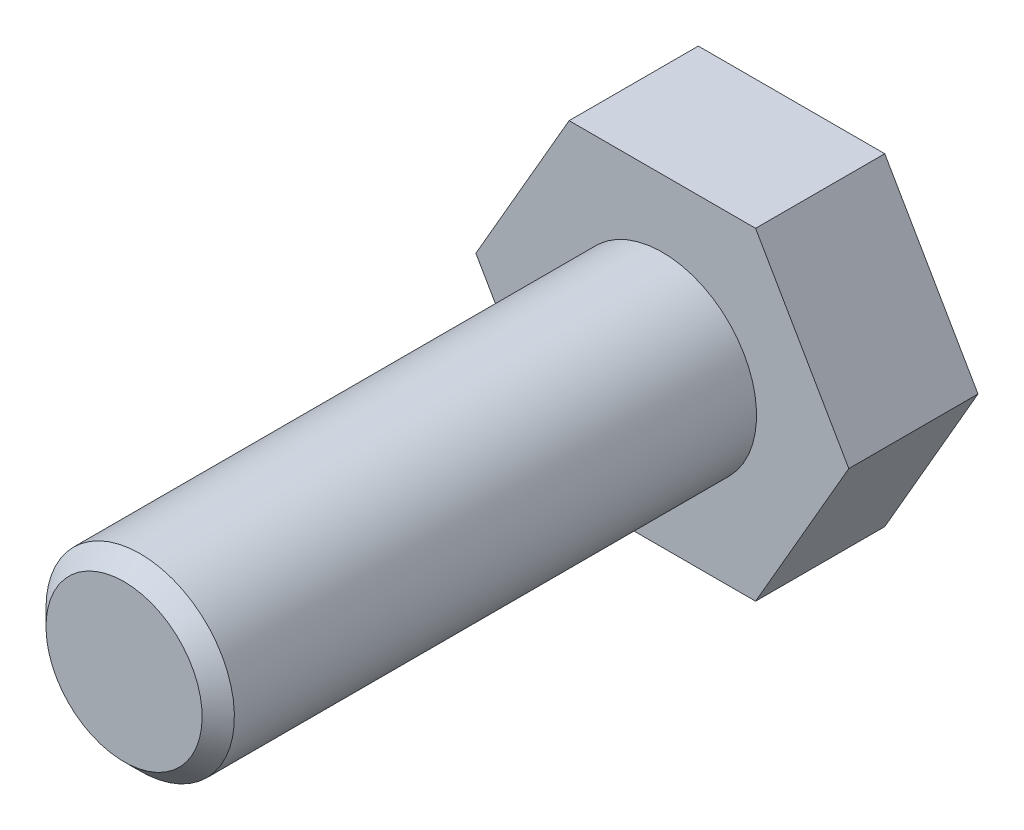
ISO-10303-21;
HEADER;
FILE_DESCRIPTION(('STEP AP214'),'2;1');
FILE_NAME('part.step','',(''),(''),'','','');
FILE_SCHEMA(('AUTOMOTIVE_DESIGN { 1 0 10303 214 1 1 1 1 }'));
ENDSEC;
DATA;
#1=APPLICATION_CONTEXT('core data for automotive mechanical design processes');
#2=APPLICATION_PROTOCOL_DEFINITION('international standard','automotive_design',2000,#1);
#3=PRODUCT_CONTEXT('',#1,'mechanical');
#4=PRODUCT('Part','Part','',(#3));
#5=PRODUCT_RELATED_PRODUCT_CATEGORY('part','',(#4));
#6=PRODUCT_DEFINITION_FORMATION('','',#4);
#7=PRODUCT_DEFINITION_CONTEXT('part definition',#1,'design');
#8=PRODUCT_DEFINITION('design','',#6,#7);
#9=PRODUCT_DEFINITION_SHAPE('','',#8);
#10=(LENGTH_UNIT() NAMED_UNIT(*) SI_UNIT(.MILLI.,.METRE.));
#11=(NAMED_UNIT(*) PLANE_ANGLE_UNIT() SI_UNIT($,.RADIAN.));
#12=(NAMED_UNIT(*) SI_UNIT($,.STERADIAN.) SOLID_ANGLE_UNIT());
#13=UNCERTAINTY_MEASURE_WITH_UNIT(LENGTH_MEASURE(1.E-05),#10,'distance_accuracy_value','');
#14=(GEOMETRIC_REPRESENTATION_CONTEXT(3) GLOBAL_UNCERTAINTY_ASSIGNED_CONTEXT((#13)) GLOBAL_UNIT_ASSIGNED_CONTEXT((#10,
#11,#12)) REPRESENTATION_CONTEXT('',''));
#15=CARTESIAN_POINT('',(0.,0.,0.));
#16=DIRECTION('',(0.,0.,1.));
#17=DIRECTION('',(1.,0.,0.));
#18=AXIS2_PLACEMENT_3D('',#15,#16,#17);
#19=CARTESIAN_POINT('',(0.,0.,0.));
#20=DIRECTION('',(0.,0.,1.));
#21=DIRECTION('',(1.,0.,0.));
#22=AXIS2_PLACEMENT_3D('',#19,#20,#21);
#23=PLANE('',#22);
#24=DIRECTION('',(0.500000000000002,-0.866025403784437,0.));
#25=VECTOR('',#24,1.);
#26=CARTESIAN_POINT('',(3.46410161513775,0.,0.));
#27=LINE('',#26,#25);
#28=CARTESIAN_POINT('',(1.73205080756886,3.00000000000001,0.));
#29=VERTEX_POINT('',#28);
#30=CARTESIAN_POINT('',(3.46410161513775,0.,0.));
#31=VERTEX_POINT('',#30);
#32=EDGE_CURVE('E117',#29,#31,#27,.T.);
#33=ORIENTED_EDGE('',*,*,#32,.T.);
#34=DIRECTION('',(-0.499999999999998,-0.86602540378444,0.));
#35=VECTOR('',#34,1.);
#36=CARTESIAN_POINT('',(1.73205080756888,-2.99999999999999,0.));
#37=LINE('',#36,#35);
#38=CARTESIAN_POINT('',(1.73205080756888,-2.99999999999999,0.));
#39=VERTEX_POINT('',#38);
#40=EDGE_CURVE('E121',#31,#39,#37,.T.);
#41=ORIENTED_EDGE('',*,*,#40,.T.);
#42=DIRECTION('',(-1.,0.,0.));
#43=VECTOR('',#42,1.);
#44=CARTESIAN_POINT('',(-1.73205080756888,-3.,0.));
#45=LINE('',#44,#43);
#46=CARTESIAN_POINT('',(-1.73205080756887,-3.,0.));
#47=VERTEX_POINT('',#46);
#48=EDGE_CURVE('E126',#39,#47,#45,.T.);
#49=ORIENTED_EDGE('',*,*,#48,.T.);
#50=DIRECTION('',(-0.5,0.866025403784438,0.));
#51=VECTOR('',#50,1.);
#52=CARTESIAN_POINT('',(-3.46410161513775,0.,0.));
#53=LINE('',#52,#51);
#54=CARTESIAN_POINT('',(-3.46410161513775,0.,0.));
#55=VERTEX_POINT('',#54);
#56=EDGE_CURVE('E82',#47,#55,#53,.T.);
#57=ORIENTED_EDGE('',*,*,#56,.T.);
#58=DIRECTION('',(0.5,0.866025403784439,0.));
#59=VECTOR('',#58,1.);
#60=CARTESIAN_POINT('',(-1.73205080756888,3.,0.));
#61=LINE('',#60,#59);
#62=CARTESIAN_POINT('',(-1.73205080756888,3.,0.));
#63=VERTEX_POINT('',#62);
#64=EDGE_CURVE('E66',#55,#63,#61,.T.);
#65=ORIENTED_EDGE('',*,*,#64,.T.);
#66=DIRECTION('',(1.,0.,0.));
#67=VECTOR('',#66,1.);
#68=CARTESIAN_POINT('',(1.73205080756887,3.,0.));
#69=LINE('',#68,#67);
#70=EDGE_CURVE('E71',#63,#29,#69,.T.);
#71=ORIENTED_EDGE('',*,*,#70,.T.);
#72=EDGE_LOOP('',(#33,#41,#49,#57,#65,#71));
#73=FACE_BOUND('',#72,.T.);
#74=ADVANCED_FACE('F16',(#73),#23,.F.);
#75=CARTESIAN_POINT('',(1.73205080756887,3.,2.4));
#76=DIRECTION('',(0.,-1.,0.));
#77=DIRECTION('',(1.,0.,0.));
#78=AXIS2_PLACEMENT_3D('',#75,#76,#77);
#79=PLANE('',#78);
#80=DIRECTION('',(0.,0.,1.));
#81=VECTOR('',#80,1.);
#82=CARTESIAN_POINT('',(-1.73205080756888,3.,2.4));
#83=LINE('',#82,#81);
#84=CARTESIAN_POINT('',(-1.73205080756888,3.,2.4));
#85=VERTEX_POINT('',#84);
#86=EDGE_CURVE('E73',#63,#85,#83,.T.);
#87=ORIENTED_EDGE('',*,*,#86,.T.);
#88=DIRECTION('',(1.,0.,0.));
#89=VECTOR('',#88,1.);
#90=CARTESIAN_POINT('',(0.,3.00000000000001,2.4));
#91=LINE('',#90,#89);
#92=CARTESIAN_POINT('',(1.73205080756886,3.00000000000001,2.4));
#93=VERTEX_POINT('',#92);
#94=EDGE_CURVE('E115',#93,#85,#91,.F.);
#95=ORIENTED_EDGE('',*,*,#94,.F.);
#96=DIRECTION('',(0.,0.,1.));
#97=VECTOR('',#96,1.);
#98=CARTESIAN_POINT('',(1.73205080756886,3.00000000000001,2.4));
#99=LINE('',#98,#97);
#100=EDGE_CURVE('E76',#93,#29,#99,.F.);
#101=ORIENTED_EDGE('',*,*,#100,.T.);
#102=ORIENTED_EDGE('',*,*,#70,.F.);
#103=EDGE_LOOP('',(#87,#95,#101,#102));
#104=FACE_BOUND('',#103,.T.);
#105=ADVANCED_FACE('F72',(#104),#79,.F.);
#106=CARTESIAN_POINT('',(-1.73205080756888,3.,2.4));
#107=DIRECTION('',(0.866025403784439,-0.5,0.));
#108=DIRECTION('',(0.5,0.866025403784439,0.));
#109=AXIS2_PLACEMENT_3D('',#106,#107,#108);
#110=PLANE('',#109);
#111=DIRECTION('',(0.,0.,1.));
#112=VECTOR('',#111,1.);
#113=CARTESIAN_POINT('',(-3.46410161513775,0.,2.4));
#114=LINE('',#113,#112);
#115=CARTESIAN_POINT('',(-3.46410161513775,0.,2.4));
#116=VERTEX_POINT('',#115);
#117=EDGE_CURVE('E84',#55,#116,#114,.T.);
#118=ORIENTED_EDGE('',*,*,#117,.T.);
#119=DIRECTION('',(-0.499999999999998,-0.866025403784439,0.));
#120=VECTOR('',#119,1.);
#121=CARTESIAN_POINT('',(-1.73205080756888,3.,2.4));
#122=LINE('',#121,#120);
#123=EDGE_CURVE('E88',#85,#116,#122,.T.);
#124=ORIENTED_EDGE('',*,*,#123,.F.);
#125=ORIENTED_EDGE('',*,*,#86,.F.);
#126=ORIENTED_EDGE('',*,*,#64,.F.);
#127=EDGE_LOOP('',(#118,#124,#125,#126));
#128=FACE_BOUND('',#127,.T.);
#129=ADVANCED_FACE('F86',(#128),#110,.F.);
#130=CARTESIAN_POINT('',(-3.46410161513775,0.,2.4));
#131=DIRECTION('',(0.866025403784438,0.5,0.));
#132=DIRECTION('',(-0.5,0.866025403784438,0.));
#133=AXIS2_PLACEMENT_3D('',#130,#131,#132);
#134=PLANE('',#133);
#135=DIRECTION('',(0.,0.,1.));
#136=VECTOR('',#135,1.);
#137=CARTESIAN_POINT('',(-1.73205080756887,-3.,2.4));
#138=LINE('',#137,#136);
#139=CARTESIAN_POINT('',(-1.73205080756887,-3.,2.4));
#140=VERTEX_POINT('',#139);
#141=EDGE_CURVE('E128',#47,#140,#138,.T.);
#142=ORIENTED_EDGE('',*,*,#141,.T.);
#143=DIRECTION('',(0.500000000000001,-0.866025403784438,0.));
#144=VECTOR('',#143,1.);
#145=CARTESIAN_POINT('',(-3.46410161513775,0.,2.4));
#146=LINE('',#145,#144);
#147=EDGE_CURVE('E111',#116,#140,#146,.T.);
#148=ORIENTED_EDGE('',*,*,#147,.F.);
#149=ORIENTED_EDGE('',*,*,#117,.F.);
#150=ORIENTED_EDGE('',*,*,#56,.F.);
#151=EDGE_LOOP('',(#142,#148,#149,#150));
#152=FACE_BOUND('',#151,.T.);
#153=ADVANCED_FACE('F132',(#152),#134,.F.);
#154=CARTESIAN_POINT('',(-1.73205080756888,-3.,2.4));
#155=DIRECTION('',(0.,1.,0.));
#156=DIRECTION('',(-1.,0.,0.));
#157=AXIS2_PLACEMENT_3D('',#154,#155,#156);
#158=PLANE('',#157);
#159=DIRECTION('',(0.,0.,1.));
#160=VECTOR('',#159,1.);
#161=CARTESIAN_POINT('',(1.73205080756888,-2.99999999999999,2.4));
#162=LINE('',#161,#160);
#163=CARTESIAN_POINT('',(1.73205080756888,-2.99999999999999,2.4));
#164=VERTEX_POINT('',#163);
#165=EDGE_CURVE('E124',#39,#164,#162,.T.);
#166=ORIENTED_EDGE('',*,*,#165,.T.);
#167=DIRECTION('',(1.,0.,0.));
#168=VECTOR('',#167,1.);
#169=CARTESIAN_POINT('',(0.,-3.,2.4));
#170=LINE('',#169,#168);
#171=EDGE_CURVE('E104',#140,#164,#170,.T.);
#172=ORIENTED_EDGE('',*,*,#171,.F.);
#173=ORIENTED_EDGE('',*,*,#141,.F.);
#174=ORIENTED_EDGE('',*,*,#48,.F.);
#175=EDGE_LOOP('',(#166,#172,#173,#174));
#176=FACE_BOUND('',#175,.T.);
#177=ADVANCED_FACE('F142',(#176),#158,.F.);
#178=CARTESIAN_POINT('',(1.73205080756888,-2.99999999999999,2.4));
#179=DIRECTION('',(-0.86602540378444,0.499999999999998,0.));
#180=DIRECTION('',(-0.499999999999998,-0.86602540378444,0.));
#181=AXIS2_PLACEMENT_3D('',#178,#179,#180);
#182=PLANE('',#181);
#183=DIRECTION('',(0.,0.,1.));
#184=VECTOR('',#183,1.);
#185=CARTESIAN_POINT('',(3.46410161513775,0.,2.4));
#186=LINE('',#185,#184);
#187=CARTESIAN_POINT('',(3.46410161513775,0.,2.4));
#188=VERTEX_POINT('',#187);
#189=EDGE_CURVE('E34',#31,#188,#186,.T.);
#190=ORIENTED_EDGE('',*,*,#189,.T.);
#191=DIRECTION('',(0.499999999999998,0.866025403784439,0.));
#192=VECTOR('',#191,1.);
#193=CARTESIAN_POINT('',(1.73205080756888,-2.99999999999999,2.4));
#194=LINE('',#193,#192);
#195=EDGE_CURVE('E100',#164,#188,#194,.T.);
#196=ORIENTED_EDGE('',*,*,#195,.F.);
#197=ORIENTED_EDGE('',*,*,#165,.F.);
#198=ORIENTED_EDGE('',*,*,#40,.F.);
#199=EDGE_LOOP('',(#190,#196,#197,#198));
#200=FACE_BOUND('',#199,.T.);
#201=ADVANCED_FACE('F140',(#200),#182,.F.);
#202=CARTESIAN_POINT('',(3.46410161513775,0.,2.4));
#203=DIRECTION('',(-0.866025403784437,-0.500000000000002,0.));
#204=DIRECTION('',(0.500000000000002,-0.866025403784437,0.));
#205=AXIS2_PLACEMENT_3D('',#202,#203,#204);
#206=PLANE('',#205);
#207=ORIENTED_EDGE('',*,*,#100,.F.);
#208=DIRECTION('',(-0.500000000000003,0.866025403784437,0.));
#209=VECTOR('',#208,1.);
#210=CARTESIAN_POINT('',(3.46410161513775,0.,2.4));
#211=LINE('',#210,#209);
#212=EDGE_CURVE('E96',#188,#93,#211,.T.);
#213=ORIENTED_EDGE('',*,*,#212,.F.);
#214=ORIENTED_EDGE('',*,*,#189,.F.);
#215=ORIENTED_EDGE('',*,*,#32,.F.);
#216=EDGE_LOOP('',(#207,#213,#214,#215));
#217=FACE_BOUND('',#216,.T.);
#218=ADVANCED_FACE('F138',(#217),#206,.F.);
#219=CARTESIAN_POINT('',(0.,0.,12.4));
#220=DIRECTION('',(0.,0.,-1.));
#221=DIRECTION('',(-1.,0.,0.));
#222=AXIS2_PLACEMENT_3D('',#219,#220,#221);
#223=PLANE('',#222);
#224=CARTESIAN_POINT('',(0.,0.,12.4000000000137));
#225=DIRECTION('',(0.,0.,-1.));
#226=DIRECTION('',(0.,1.,0.));
#227=AXIS2_PLACEMENT_3D('',#224,#225,#226);
#228=CIRCLE('',#227,1.44999999992023);
#229=CARTESIAN_POINT('',(0.,1.44999999992024,12.4000000000137));
#230=VERTEX_POINT('',#229);
#231=EDGE_CURVE('E19',#230,#230,#228,.T.);
#232=ORIENTED_EDGE('',*,*,#231,.F.);
#233=EDGE_LOOP('',(#232));
#234=FACE_BOUND('',#233,.T.);
#235=ADVANCED_FACE('F165',(#234),#223,.F.);
#236=CARTESIAN_POINT('',(0.,0.,2.4));
#237=DIRECTION('',(0.,0.,1.));
#238=DIRECTION('',(1.,0.,0.));
#239=AXIS2_PLACEMENT_3D('',#236,#237,#238);
#240=PLANE('',#239);
#241=ORIENTED_EDGE('',*,*,#195,.T.);
#242=ORIENTED_EDGE('',*,*,#212,.T.);
#243=ORIENTED_EDGE('',*,*,#94,.T.);
#244=ORIENTED_EDGE('',*,*,#123,.T.);
#245=ORIENTED_EDGE('',*,*,#147,.T.);
#246=ORIENTED_EDGE('',*,*,#171,.T.);
#247=EDGE_LOOP('',(#241,#242,#243,#244,#245,#246));
#248=FACE_BOUND('',#247,.T.);
#249=CARTESIAN_POINT('',(0.,0.,2.4));
#250=DIRECTION('',(0.,0.,-1.));
#251=DIRECTION('',(-1.,0.,0.));
#252=AXIS2_PLACEMENT_3D('',#249,#250,#251);
#253=CIRCLE('',#252,1.75);
#254=CARTESIAN_POINT('',(-1.75,0.,2.4));
#255=VERTEX_POINT('',#254);
#256=EDGE_CURVE('E25',#255,#255,#253,.F.);
#257=ORIENTED_EDGE('',*,*,#256,.F.);
#258=EDGE_LOOP('',(#257));
#259=FACE_BOUND('',#258,.T.);
#260=ADVANCED_FACE('F135',(#248,#259),#240,.T.);
#261=CARTESIAN_POINT('',(0.,0.,12.0999999999185));
#262=DIRECTION('',(0.,0.,-1.));
#263=DIRECTION('',(0.,1.,0.));
#264=AXIS2_PLACEMENT_3D('',#261,#262,#263);
#265=CONICAL_SURFACE('',#264,1.74999999995861,0.785398163302709);
#266=CARTESIAN_POINT('',(0.,0.,12.1));
#267=DIRECTION('',(0.,0.,-1.));
#268=DIRECTION('',(-1.,0.,0.));
#269=AXIS2_PLACEMENT_3D('',#266,#267,#268);
#270=CIRCLE('',#269,1.75);
#271=CARTESIAN_POINT('',(-1.75,0.,12.1));
#272=VERTEX_POINT('',#271);
#273=EDGE_CURVE('E11',#272,#272,#270,.T.);
#274=ORIENTED_EDGE('',*,*,#273,.F.);
#275=EDGE_LOOP('',(#274));
#276=FACE_BOUND('',#275,.T.);
#277=ORIENTED_EDGE('',*,*,#231,.T.);
#278=EDGE_LOOP('',(#277));
#279=FACE_BOUND('',#278,.T.);
#280=ADVANCED_FACE('F154',(#276,#279),#265,.T.);
#281=CARTESIAN_POINT('',(0.,0.,12.4));
#282=DIRECTION('',(0.,0.,-1.));
#283=DIRECTION('',(-1.,0.,0.));
#284=AXIS2_PLACEMENT_3D('',#281,#282,#283);
#285=CYLINDRICAL_SURFACE('',#284,1.75);
#286=ORIENTED_EDGE('',*,*,#273,.T.);
#287=EDGE_LOOP('',(#286));
#288=FACE_BOUND('',#287,.T.);
#289=ORIENTED_EDGE('',*,*,#256,.T.);
#290=EDGE_LOOP('',(#289));
#291=FACE_BOUND('',#290,.T.);
#292=ADVANCED_FACE('F152',(#288,#291),#285,.T.);
#293=CLOSED_SHELL('',(#74,#105,#129,#153,#177,#201,#218,#235,#260,#280,#292));
#294=MANIFOLD_SOLID_BREP('B1',#293);
#295=ADVANCED_BREP_SHAPE_REPRESENTATION('',(#18,#294),#14);
#296=SHAPE_DEFINITION_REPRESENTATION(#9,#295);
ENDSEC;
END-ISO-10303-21;
